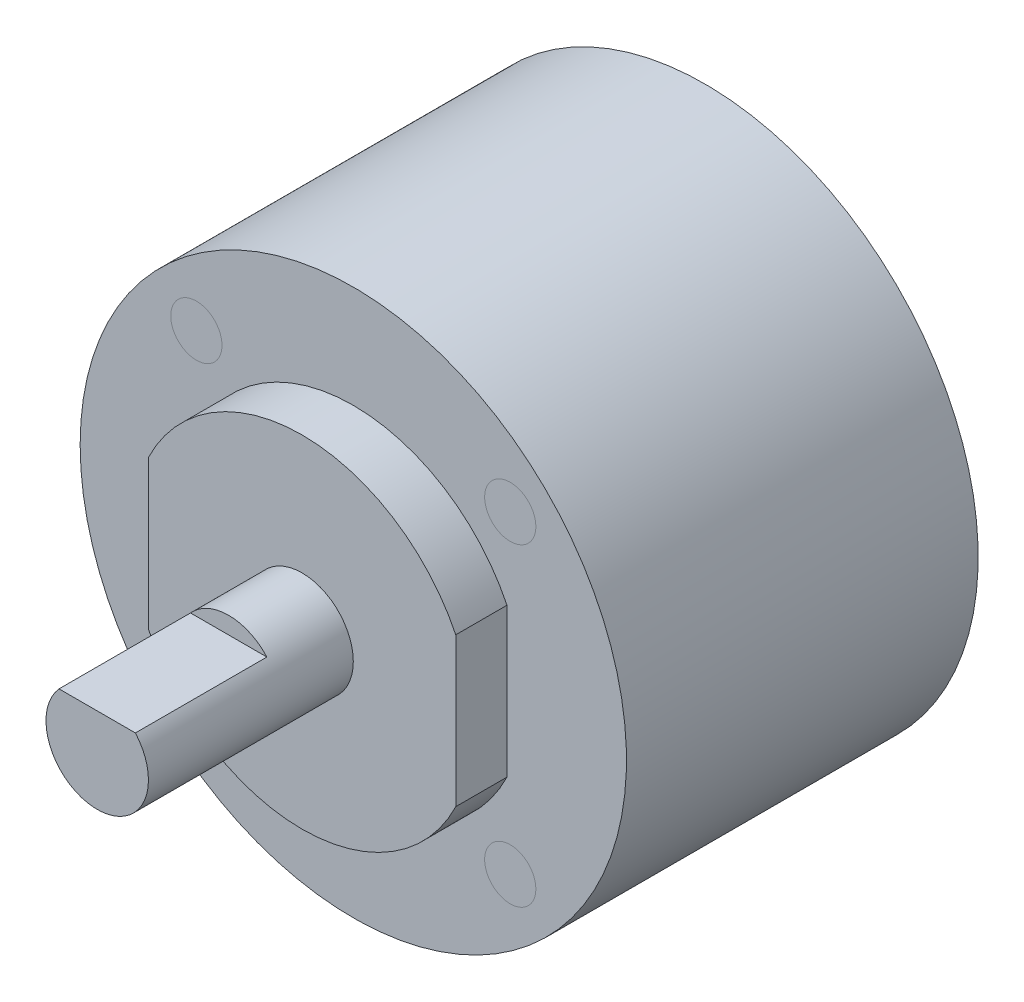
ISO-10303-21;
HEADER;
FILE_DESCRIPTION(('STEP AP214'),'2;1');
FILE_NAME('part.step','',(''),(''),'','','');
FILE_SCHEMA(('AUTOMOTIVE_DESIGN { 1 0 10303 214 1 1 1 1 }'));
ENDSEC;
DATA;
#1=APPLICATION_CONTEXT('core data for automotive mechanical design processes');
#2=APPLICATION_PROTOCOL_DEFINITION('international standard','automotive_design',2000,#1);
#3=PRODUCT_CONTEXT('',#1,'mechanical');
#4=PRODUCT('Part','Part','',(#3));
#5=PRODUCT_RELATED_PRODUCT_CATEGORY('part','',(#4));
#6=PRODUCT_DEFINITION_FORMATION('','',#4);
#7=PRODUCT_DEFINITION_CONTEXT('part definition',#1,'design');
#8=PRODUCT_DEFINITION('design','',#6,#7);
#9=PRODUCT_DEFINITION_SHAPE('','',#8);
#10=(LENGTH_UNIT() NAMED_UNIT(*) SI_UNIT(.MILLI.,.METRE.));
#11=(NAMED_UNIT(*) PLANE_ANGLE_UNIT() SI_UNIT($,.RADIAN.));
#12=(NAMED_UNIT(*) SI_UNIT($,.STERADIAN.) SOLID_ANGLE_UNIT());
#13=UNCERTAINTY_MEASURE_WITH_UNIT(LENGTH_MEASURE(1.E-05),#10,'distance_accuracy_value','');
#14=(GEOMETRIC_REPRESENTATION_CONTEXT(3) GLOBAL_UNCERTAINTY_ASSIGNED_CONTEXT((#13)) GLOBAL_UNIT_ASSIGNED_CONTEXT((#10,
#11,#12)) REPRESENTATION_CONTEXT('',''));
#15=CARTESIAN_POINT('',(0.,0.,0.));
#16=DIRECTION('',(0.,0.,1.));
#17=DIRECTION('',(1.,0.,0.));
#18=AXIS2_PLACEMENT_3D('',#15,#16,#17);
#19=CARTESIAN_POINT('',(0.,0.,39.9));
#20=DIRECTION('',(0.,0.,-1.));
#21=DIRECTION('',(-1.,0.,0.));
#22=AXIS2_PLACEMENT_3D('',#19,#20,#21);
#23=CYLINDRICAL_SURFACE('',#22,3.);
#24=CARTESIAN_POINT('',(0.,0.,23.6));
#25=DIRECTION('',(0.,0.,1.));
#26=DIRECTION('',(1.,0.,0.));
#27=AXIS2_PLACEMENT_3D('',#24,#25,#26);
#28=CIRCLE('',#27,3.);
#29=CARTESIAN_POINT('',(3.,0.,23.6));
#30=VERTEX_POINT('',#29);
#31=EDGE_CURVE('E103',#30,#30,#28,.T.);
#32=ORIENTED_EDGE('',*,*,#31,.T.);
#33=EDGE_LOOP('',(#32));
#34=FACE_BOUND('',#33,.T.);
#35=CARTESIAN_POINT('',(0.,0.,35.6));
#36=DIRECTION('',(0.,0.,1.));
#37=DIRECTION('',(1.,0.,0.));
#38=AXIS2_PLACEMENT_3D('',#35,#36,#37);
#39=CIRCLE('',#38,3.);
#40=CARTESIAN_POINT('',(-2.23606797749979,2.,35.6));
#41=VERTEX_POINT('',#40);
#42=CARTESIAN_POINT('',(2.23606797749979,2.,35.6));
#43=VERTEX_POINT('',#42);
#44=EDGE_CURVE('E48',#41,#43,#39,.T.);
#45=ORIENTED_EDGE('',*,*,#44,.F.);
#46=DIRECTION('',(0.,0.,1.));
#47=VECTOR('',#46,1.);
#48=CARTESIAN_POINT('',(-2.23606797749979,2.,27.9));
#49=LINE('',#48,#47);
#50=CARTESIAN_POINT('',(-2.23606797749979,2.,27.9));
#51=VERTEX_POINT('',#50);
#52=EDGE_CURVE('E91',#51,#41,#49,.T.);
#53=ORIENTED_EDGE('',*,*,#52,.F.);
#54=CARTESIAN_POINT('',(0.,0.,27.9));
#55=DIRECTION('',(0.,0.,1.));
#56=DIRECTION('',(-1.,0.,0.));
#57=AXIS2_PLACEMENT_3D('',#54,#55,#56);
#58=CIRCLE('',#57,3.);
#59=CARTESIAN_POINT('',(2.23606797749979,2.,27.9));
#60=VERTEX_POINT('',#59);
#61=EDGE_CURVE('E93',#60,#51,#58,.T.);
#62=ORIENTED_EDGE('',*,*,#61,.F.);
#63=DIRECTION('',(0.,0.,1.));
#64=VECTOR('',#63,1.);
#65=CARTESIAN_POINT('',(2.23606797749979,2.,27.9));
#66=LINE('',#65,#64);
#67=EDGE_CURVE('E92',#60,#43,#66,.T.);
#68=ORIENTED_EDGE('',*,*,#67,.T.);
#69=EDGE_LOOP('',(#45,#53,#62,#68));
#70=FACE_BOUND('',#69,.T.);
#71=ADVANCED_FACE('F35',(#34,#70),#23,.T.);
#72=CARTESIAN_POINT('',(-2.23606797749979,2.,27.9));
#73=DIRECTION('',(0.,-1.,0.));
#74=DIRECTION('',(0.,0.,-1.));
#75=AXIS2_PLACEMENT_3D('',#72,#73,#74);
#76=PLANE('',#75);
#77=DIRECTION('',(-1.,0.,0.));
#78=VECTOR('',#77,1.);
#79=CARTESIAN_POINT('',(-2.23606797749979,2.,35.6));
#80=LINE('',#79,#78);
#81=EDGE_CURVE('E11',#43,#41,#80,.T.);
#82=ORIENTED_EDGE('',*,*,#81,.F.);
#83=ORIENTED_EDGE('',*,*,#67,.F.);
#84=DIRECTION('',(1.,0.,0.));
#85=VECTOR('',#84,1.);
#86=CARTESIAN_POINT('',(-2.23606797749979,2.,27.9));
#87=LINE('',#86,#85);
#88=EDGE_CURVE('E98',#51,#60,#87,.T.);
#89=ORIENTED_EDGE('',*,*,#88,.F.);
#90=ORIENTED_EDGE('',*,*,#52,.T.);
#91=EDGE_LOOP('',(#82,#83,#89,#90));
#92=FACE_BOUND('',#91,.T.);
#93=ADVANCED_FACE('F96',(#92),#76,.F.);
#94=CARTESIAN_POINT('',(0.,0.,0.));
#95=DIRECTION('',(0.,0.,1.));
#96=DIRECTION('',(1.,0.,0.));
#97=AXIS2_PLACEMENT_3D('',#94,#95,#96);
#98=PLANE('',#97);
#99=CARTESIAN_POINT('',(0.,0.,0.));
#100=DIRECTION('',(0.,0.,1.));
#101=DIRECTION('',(1.,0.,0.));
#102=AXIS2_PLACEMENT_3D('',#99,#100,#101);
#103=CIRCLE('',#102,16.);
#104=CARTESIAN_POINT('',(-16.,0.,0.));
#105=VERTEX_POINT('',#104);
#106=EDGE_CURVE('E138',#105,#105,#103,.T.);
#107=ORIENTED_EDGE('',*,*,#106,.F.);
#108=EDGE_LOOP('',(#107));
#109=FACE_BOUND('',#108,.T.);
#110=CARTESIAN_POINT('',(5.65685424949238,-5.65685424949238,0.));
#111=DIRECTION('',(0.,0.,1.));
#112=DIRECTION('',(1.,0.,0.));
#113=AXIS2_PLACEMENT_3D('',#110,#111,#112);
#114=CIRCLE('',#113,1.55);
#115=CARTESIAN_POINT('',(7.20685424949238,-5.65685424949238,0.));
#116=VERTEX_POINT('',#115);
#117=EDGE_CURVE('E158',#116,#116,#114,.F.);
#118=ORIENTED_EDGE('',*,*,#117,.F.);
#119=EDGE_LOOP('',(#118));
#120=FACE_BOUND('',#119,.T.);
#121=CARTESIAN_POINT('',(-5.65685424949238,5.65685424949238,0.));
#122=DIRECTION('',(0.,0.,1.));
#123=DIRECTION('',(1.,0.,0.));
#124=AXIS2_PLACEMENT_3D('',#121,#122,#123);
#125=CIRCLE('',#124,1.55);
#126=CARTESIAN_POINT('',(-4.10685424949238,5.65685424949238,0.));
#127=VERTEX_POINT('',#126);
#128=EDGE_CURVE('E43',#127,#127,#125,.F.);
#129=ORIENTED_EDGE('',*,*,#128,.F.);
#130=EDGE_LOOP('',(#129));
#131=FACE_BOUND('',#130,.T.);
#132=ADVANCED_FACE('F169',(#109,#120,#131),#98,.F.);
#133=ORIENTED_EDGE('',*,*,#128,.T.);
#134=EDGE_LOOP('',(#133));
#135=FACE_BOUND('',#134,.T.);
#136=ADVANCED_FACE('F167',(#135),#98,.F.);
#137=CARTESIAN_POINT('',(0.,0.,20.6));
#138=DIRECTION('',(0.,0.,1.));
#139=DIRECTION('',(1.,0.,0.));
#140=AXIS2_PLACEMENT_3D('',#137,#138,#139);
#141=PLANE('',#140);
#142=CARTESIAN_POINT('',(-9.1923881554251,-9.19238815542514,20.6));
#143=DIRECTION('',(0.,0.,1.));
#144=DIRECTION('',(1.,0.,0.));
#145=AXIS2_PLACEMENT_3D('',#142,#143,#144);
#146=CIRCLE('',#145,1.5);
#147=CARTESIAN_POINT('',(-7.6923881554251,-9.19238815542514,20.6));
#148=VERTEX_POINT('',#147);
#149=EDGE_CURVE('E150',#148,#148,#146,.F.);
#150=ORIENTED_EDGE('',*,*,#149,.T.);
#151=EDGE_LOOP('',(#150));
#152=FACE_BOUND('',#151,.T.);
#153=CARTESIAN_POINT('',(9.1923881554251,9.19238815542514,20.6));
#154=DIRECTION('',(0.,0.,1.));
#155=DIRECTION('',(1.,0.,0.));
#156=AXIS2_PLACEMENT_3D('',#153,#154,#155);
#157=CIRCLE('',#156,1.5);
#158=CARTESIAN_POINT('',(10.6923881554251,9.19238815542514,20.6));
#159=VERTEX_POINT('',#158);
#160=EDGE_CURVE('E106',#159,#159,#157,.F.);
#161=ORIENTED_EDGE('',*,*,#160,.T.);
#162=EDGE_LOOP('',(#161));
#163=FACE_BOUND('',#162,.T.);
#164=CARTESIAN_POINT('',(0.,0.,20.6));
#165=DIRECTION('',(0.,0.,1.));
#166=DIRECTION('',(1.,0.,0.));
#167=AXIS2_PLACEMENT_3D('',#164,#165,#166);
#168=CIRCLE('',#167,10.);
#169=CARTESIAN_POINT('',(9.,4.35889894354068,20.6));
#170=VERTEX_POINT('',#169);
#171=CARTESIAN_POINT('',(-9.,4.35889894354068,20.6));
#172=VERTEX_POINT('',#171);
#173=EDGE_CURVE('E56',#170,#172,#168,.T.);
#174=ORIENTED_EDGE('',*,*,#173,.F.);
#175=DIRECTION('',(0.,1.,0.));
#176=VECTOR('',#175,1.);
#177=CARTESIAN_POINT('',(9.,-4.35889894354068,20.6));
#178=LINE('',#177,#176);
#179=CARTESIAN_POINT('',(9.,-4.35889894354068,20.6));
#180=VERTEX_POINT('',#179);
#181=EDGE_CURVE('E112',#180,#170,#178,.T.);
#182=ORIENTED_EDGE('',*,*,#181,.F.);
#183=CARTESIAN_POINT('',(0.,0.,20.6));
#184=DIRECTION('',(0.,0.,1.));
#185=DIRECTION('',(1.,0.,0.));
#186=AXIS2_PLACEMENT_3D('',#183,#184,#185);
#187=CIRCLE('',#186,10.);
#188=CARTESIAN_POINT('',(-9.,-4.35889894354068,20.6));
#189=VERTEX_POINT('',#188);
#190=EDGE_CURVE('E123',#189,#180,#187,.T.);
#191=ORIENTED_EDGE('',*,*,#190,.F.);
#192=DIRECTION('',(0.,-1.,0.));
#193=VECTOR('',#192,1.);
#194=CARTESIAN_POINT('',(-9.,4.35889894354068,20.6));
#195=LINE('',#194,#193);
#196=EDGE_CURVE('E120',#172,#189,#195,.T.);
#197=ORIENTED_EDGE('',*,*,#196,.F.);
#198=EDGE_LOOP('',(#174,#182,#191,#197));
#199=FACE_BOUND('',#198,.T.);
#200=CARTESIAN_POINT('',(0.,0.,20.6));
#201=DIRECTION('',(0.,0.,1.));
#202=DIRECTION('',(1.,0.,0.));
#203=AXIS2_PLACEMENT_3D('',#200,#201,#202);
#204=CIRCLE('',#203,16.);
#205=CARTESIAN_POINT('',(-16.,0.,20.6));
#206=VERTEX_POINT('',#205);
#207=EDGE_CURVE('E107',#206,#206,#204,.T.);
#208=ORIENTED_EDGE('',*,*,#207,.T.);
#209=EDGE_LOOP('',(#208));
#210=FACE_BOUND('',#209,.T.);
#211=CARTESIAN_POINT('',(9.19238815542514,-9.1923881554251,20.6));
#212=DIRECTION('',(0.,0.,1.));
#213=DIRECTION('',(1.,0.,0.));
#214=AXIS2_PLACEMENT_3D('',#211,#212,#213);
#215=CIRCLE('',#214,1.5);
#216=CARTESIAN_POINT('',(10.6923881554251,-9.1923881554251,20.6));
#217=VERTEX_POINT('',#216);
#218=EDGE_CURVE('E146',#217,#217,#215,.F.);
#219=ORIENTED_EDGE('',*,*,#218,.T.);
#220=EDGE_LOOP('',(#219));
#221=FACE_BOUND('',#220,.T.);
#222=CARTESIAN_POINT('',(-9.19238815542514,9.1923881554251,20.6));
#223=DIRECTION('',(0.,0.,1.));
#224=DIRECTION('',(1.,0.,0.));
#225=AXIS2_PLACEMENT_3D('',#222,#223,#224);
#226=CIRCLE('',#225,1.5);
#227=CARTESIAN_POINT('',(-7.69238815542514,9.1923881554251,20.6));
#228=VERTEX_POINT('',#227);
#229=EDGE_CURVE('E154',#228,#228,#226,.F.);
#230=ORIENTED_EDGE('',*,*,#229,.T.);
#231=EDGE_LOOP('',(#230));
#232=FACE_BOUND('',#231,.T.);
#233=ADVANCED_FACE('F176',(#152,#163,#199,#210,#221,#232),#141,.T.);
#234=ORIENTED_EDGE('',*,*,#229,.F.);
#235=EDGE_LOOP('',(#234));
#236=FACE_BOUND('',#235,.T.);
#237=ADVANCED_FACE('F222',(#236),#141,.T.);
#238=ORIENTED_EDGE('',*,*,#149,.F.);
#239=EDGE_LOOP('',(#238));
#240=FACE_BOUND('',#239,.T.);
#241=ADVANCED_FACE('F225',(#240),#141,.T.);
#242=ORIENTED_EDGE('',*,*,#218,.F.);
#243=EDGE_LOOP('',(#242));
#244=FACE_BOUND('',#243,.T.);
#245=ADVANCED_FACE('F215',(#244),#141,.T.);
#246=CARTESIAN_POINT('',(0.,0.,20.6));
#247=DIRECTION('',(0.,0.,-1.));
#248=DIRECTION('',(-1.,0.,0.));
#249=AXIS2_PLACEMENT_3D('',#246,#247,#248);
#250=CYLINDRICAL_SURFACE('',#249,16.);
#251=CARTESIAN_POINT('',(-16.,0.,20.6));
#252=CARTESIAN_POINT('',(-16.,0.,20.3854166666667));
#253=CARTESIAN_POINT('',(-16.,0.,20.1708333333333));
#254=CARTESIAN_POINT('',(-16.,0.,19.7416666666667));
#255=CARTESIAN_POINT('',(-16.,0.,19.5270833333333));
#256=CARTESIAN_POINT('',(-16.,0.,19.0979166666667));
#257=CARTESIAN_POINT('',(-16.,0.,18.8833333333333));
#258=CARTESIAN_POINT('',(-16.,0.,18.4541666666667));
#259=CARTESIAN_POINT('',(-16.,0.,18.2395833333333));
#260=CARTESIAN_POINT('',(-16.,0.,17.8104166666667));
#261=CARTESIAN_POINT('',(-16.,0.,17.5958333333333));
#262=CARTESIAN_POINT('',(-16.,0.,17.1666666666667));
#263=CARTESIAN_POINT('',(-16.,0.,16.9520833333333));
#264=CARTESIAN_POINT('',(-16.,0.,16.5229166666667));
#265=CARTESIAN_POINT('',(-16.,0.,16.3083333333333));
#266=CARTESIAN_POINT('',(-16.,0.,15.8791666666667));
#267=CARTESIAN_POINT('',(-16.,0.,15.6645833333333));
#268=CARTESIAN_POINT('',(-16.,0.,15.2354166666667));
#269=CARTESIAN_POINT('',(-16.,0.,15.0208333333333));
#270=CARTESIAN_POINT('',(-16.,0.,14.5916666666667));
#271=CARTESIAN_POINT('',(-16.,0.,14.3770833333333));
#272=CARTESIAN_POINT('',(-16.,0.,13.9479166666667));
#273=CARTESIAN_POINT('',(-16.,0.,13.7333333333333));
#274=CARTESIAN_POINT('',(-16.,0.,13.3041666666667));
#275=CARTESIAN_POINT('',(-16.,0.,13.0895833333333));
#276=CARTESIAN_POINT('',(-16.,0.,12.6604166666667));
#277=CARTESIAN_POINT('',(-16.,0.,12.4458333333333));
#278=CARTESIAN_POINT('',(-16.,0.,12.0166666666667));
#279=CARTESIAN_POINT('',(-16.,0.,11.8020833333333));
#280=CARTESIAN_POINT('',(-16.,0.,11.3729166666667));
#281=CARTESIAN_POINT('',(-16.,0.,11.1583333333333));
#282=CARTESIAN_POINT('',(-16.,0.,10.7291666666667));
#283=CARTESIAN_POINT('',(-16.,0.,10.5145833333333));
#284=CARTESIAN_POINT('',(-16.,0.,10.0854166666667));
#285=CARTESIAN_POINT('',(-16.,0.,9.87083333333333));
#286=CARTESIAN_POINT('',(-16.,0.,9.44166666666666));
#287=CARTESIAN_POINT('',(-16.,0.,9.22708333333333));
#288=CARTESIAN_POINT('',(-16.,0.,8.79791666666666));
#289=CARTESIAN_POINT('',(-16.,0.,8.58333333333333));
#290=CARTESIAN_POINT('',(-16.,0.,8.15416666666666));
#291=CARTESIAN_POINT('',(-16.,0.,7.93958333333333));
#292=CARTESIAN_POINT('',(-16.,0.,7.51041666666666));
#293=CARTESIAN_POINT('',(-16.,0.,7.29583333333333));
#294=CARTESIAN_POINT('',(-16.,0.,6.86666666666666));
#295=CARTESIAN_POINT('',(-16.,0.,6.65208333333333));
#296=CARTESIAN_POINT('',(-16.,0.,6.22291666666666));
#297=CARTESIAN_POINT('',(-16.,0.,6.00833333333333));
#298=CARTESIAN_POINT('',(-16.,0.,5.57916666666666));
#299=CARTESIAN_POINT('',(-16.,0.,5.36458333333333));
#300=CARTESIAN_POINT('',(-16.,0.,4.93541666666666));
#301=CARTESIAN_POINT('',(-16.,0.,4.72083333333333));
#302=CARTESIAN_POINT('',(-16.,0.,4.29166666666667));
#303=CARTESIAN_POINT('',(-16.,0.,4.07708333333333));
#304=CARTESIAN_POINT('',(-16.,0.,3.64791666666666));
#305=CARTESIAN_POINT('',(-16.,0.,3.43333333333333));
#306=CARTESIAN_POINT('',(-16.,0.,3.00416666666666));
#307=CARTESIAN_POINT('',(-16.,0.,2.78958333333333));
#308=CARTESIAN_POINT('',(-16.,0.,2.36041666666666));
#309=CARTESIAN_POINT('',(-16.,0.,2.14583333333333));
#310=CARTESIAN_POINT('',(-16.,0.,1.71666666666667));
#311=CARTESIAN_POINT('',(-16.,0.,1.50208333333333));
#312=CARTESIAN_POINT('',(-16.,0.,1.07291666666666));
#313=CARTESIAN_POINT('',(-16.,0.,0.858333333333329));
#314=CARTESIAN_POINT('',(-16.,0.,0.429166666666662));
#315=CARTESIAN_POINT('',(-16.,0.,0.21458333333333));
#316=CARTESIAN_POINT('',(-16.,0.,0.));
#317=B_SPLINE_CURVE_WITH_KNOTS('',3,(#251,#252,#253,#254,#255,#256,#257,#258,#259,#260,#261,
#262,#263,#264,#265,#266,#267,#268,#269,#270,#271,#272,#273,#274,#275,#276,#277,#278,#279,#280,
#281,#282,#283,#284,#285,#286,#287,#288,#289,#290,#291,#292,#293,#294,#295,#296,#297,#298,#299,
#300,#301,#302,#303,#304,#305,#306,#307,#308,#309,#310,#311,#312,#313,#314,#315,#316),
.UNSPECIFIED.,.F.,.F.,(4,2,2,2,2,2,2,2,2,2,2,2,2,2,2,2,2,2,2,2,2,2,2,2,2,2,2,2,2,2,2,2,4),(0.,
0.643750000000002,1.2875,1.93125,2.575,3.21875,3.8625,4.50625,5.15,5.79375,6.4375,7.08125,7.725,
8.36875,9.0125,9.65625,10.3,10.94375,11.5875,12.23125,12.875,13.51875,14.1625,14.80625,15.45,
16.09375,16.7375,17.38125,18.025,18.66875,19.3125,19.95625,20.6),.UNSPECIFIED.);
#318=EDGE_CURVE('BSEAM37',#206,#105,#317,.T.);
#319=ORIENTED_EDGE('',*,*,#207,.F.);
#320=ORIENTED_EDGE('',*,*,#106,.T.);
#321=ORIENTED_EDGE('',*,*,#318,.T.);
#322=ORIENTED_EDGE('',*,*,#318,.F.);
#323=EDGE_LOOP('',(#319,#321,#320,#322));
#324=FACE_BOUND('',#323,.T.);
#325=ADVANCED_FACE('F37',(#324),#250,.T.);
#326=ORIENTED_EDGE('',*,*,#160,.F.);
#327=EDGE_LOOP('',(#326));
#328=FACE_BOUND('',#327,.T.);
#329=ADVANCED_FACE('F184',(#328),#141,.T.);
#330=ORIENTED_EDGE('',*,*,#117,.T.);
#331=EDGE_LOOP('',(#330));
#332=FACE_BOUND('',#331,.T.);
#333=ADVANCED_FACE('F172',(#332),#98,.F.);
#334=CARTESIAN_POINT('',(0.,0.,23.6));
#335=DIRECTION('',(0.,0.,-1.));
#336=DIRECTION('',(-1.,0.,0.));
#337=AXIS2_PLACEMENT_3D('',#334,#335,#336);
#338=CYLINDRICAL_SURFACE('',#337,10.);
#339=ORIENTED_EDGE('',*,*,#173,.T.);
#340=DIRECTION('',(0.,0.,-1.));
#341=VECTOR('',#340,1.);
#342=CARTESIAN_POINT('',(-9.,4.35889894354068,23.6));
#343=LINE('',#342,#341);
#344=CARTESIAN_POINT('',(-9.,4.35889894354068,23.6));
#345=VERTEX_POINT('',#344);
#346=EDGE_CURVE('E135',#345,#172,#343,.T.);
#347=ORIENTED_EDGE('',*,*,#346,.F.);
#348=CARTESIAN_POINT('',(0.,0.,23.6));
#349=DIRECTION('',(0.,0.,1.));
#350=DIRECTION('',(1.,0.,0.));
#351=AXIS2_PLACEMENT_3D('',#348,#349,#350);
#352=CIRCLE('',#351,10.);
#353=CARTESIAN_POINT('',(9.,4.35889894354068,23.6));
#354=VERTEX_POINT('',#353);
#355=EDGE_CURVE('E108',#354,#345,#352,.T.);
#356=ORIENTED_EDGE('',*,*,#355,.F.);
#357=DIRECTION('',(0.,0.,-1.));
#358=VECTOR('',#357,1.);
#359=CARTESIAN_POINT('',(9.,4.35889894354068,23.6));
#360=LINE('',#359,#358);
#361=EDGE_CURVE('E118',#354,#170,#360,.T.);
#362=ORIENTED_EDGE('',*,*,#361,.T.);
#363=EDGE_LOOP('',(#339,#347,#356,#362));
#364=FACE_BOUND('',#363,.T.);
#365=ADVANCED_FACE('F183',(#364),#338,.T.);
#366=CARTESIAN_POINT('',(-9.,4.35889894354068,23.6));
#367=DIRECTION('',(1.,0.,0.));
#368=DIRECTION('',(0.,0.,-1.));
#369=AXIS2_PLACEMENT_3D('',#366,#367,#368);
#370=PLANE('',#369);
#371=ORIENTED_EDGE('',*,*,#196,.T.);
#372=DIRECTION('',(0.,0.,-1.));
#373=VECTOR('',#372,1.);
#374=CARTESIAN_POINT('',(-9.,-4.35889894354068,23.6));
#375=LINE('',#374,#373);
#376=CARTESIAN_POINT('',(-9.,-4.35889894354068,23.6));
#377=VERTEX_POINT('',#376);
#378=EDGE_CURVE('E132',#377,#189,#375,.T.);
#379=ORIENTED_EDGE('',*,*,#378,.F.);
#380=DIRECTION('',(0.,-1.,0.));
#381=VECTOR('',#380,1.);
#382=CARTESIAN_POINT('',(-9.,4.35889894354068,23.6));
#383=LINE('',#382,#381);
#384=EDGE_CURVE('E111',#345,#377,#383,.T.);
#385=ORIENTED_EDGE('',*,*,#384,.F.);
#386=ORIENTED_EDGE('',*,*,#346,.T.);
#387=EDGE_LOOP('',(#371,#379,#385,#386));
#388=FACE_BOUND('',#387,.T.);
#389=ADVANCED_FACE('F206',(#388),#370,.F.);
#390=CARTESIAN_POINT('',(0.,0.,23.6));
#391=DIRECTION('',(0.,0.,-1.));
#392=DIRECTION('',(-1.,0.,0.));
#393=AXIS2_PLACEMENT_3D('',#390,#391,#392);
#394=CYLINDRICAL_SURFACE('',#393,10.);
#395=ORIENTED_EDGE('',*,*,#190,.T.);
#396=DIRECTION('',(0.,0.,-1.));
#397=VECTOR('',#396,1.);
#398=CARTESIAN_POINT('',(9.,-4.35889894354068,23.6));
#399=LINE('',#398,#397);
#400=CARTESIAN_POINT('',(9.,-4.35889894354068,23.6));
#401=VERTEX_POINT('',#400);
#402=EDGE_CURVE('E129',#401,#180,#399,.T.);
#403=ORIENTED_EDGE('',*,*,#402,.F.);
#404=CARTESIAN_POINT('',(0.,0.,23.6));
#405=DIRECTION('',(0.,0.,1.));
#406=DIRECTION('',(1.,0.,0.));
#407=AXIS2_PLACEMENT_3D('',#404,#405,#406);
#408=CIRCLE('',#407,10.);
#409=EDGE_CURVE('E114',#377,#401,#408,.T.);
#410=ORIENTED_EDGE('',*,*,#409,.F.);
#411=ORIENTED_EDGE('',*,*,#378,.T.);
#412=EDGE_LOOP('',(#395,#403,#410,#411));
#413=FACE_BOUND('',#412,.T.);
#414=ADVANCED_FACE('F202',(#413),#394,.T.);
#415=CARTESIAN_POINT('',(9.,-4.35889894354068,23.6));
#416=DIRECTION('',(-1.,0.,0.));
#417=DIRECTION('',(0.,0.,1.));
#418=AXIS2_PLACEMENT_3D('',#415,#416,#417);
#419=PLANE('',#418);
#420=ORIENTED_EDGE('',*,*,#181,.T.);
#421=ORIENTED_EDGE('',*,*,#361,.F.);
#422=DIRECTION('',(0.,1.,0.));
#423=VECTOR('',#422,1.);
#424=CARTESIAN_POINT('',(9.,-4.35889894354068,23.6));
#425=LINE('',#424,#423);
#426=EDGE_CURVE('E116',#401,#354,#425,.T.);
#427=ORIENTED_EDGE('',*,*,#426,.F.);
#428=ORIENTED_EDGE('',*,*,#402,.T.);
#429=EDGE_LOOP('',(#420,#421,#427,#428));
#430=FACE_BOUND('',#429,.T.);
#431=ADVANCED_FACE('F198',(#430),#419,.F.);
#432=CARTESIAN_POINT('',(0.,0.,23.6));
#433=DIRECTION('',(0.,0.,1.));
#434=DIRECTION('',(1.,0.,0.));
#435=AXIS2_PLACEMENT_3D('',#432,#433,#434);
#436=PLANE('',#435);
#437=ORIENTED_EDGE('',*,*,#31,.F.);
#438=EDGE_LOOP('',(#437));
#439=FACE_BOUND('',#438,.T.);
#440=ORIENTED_EDGE('',*,*,#355,.T.);
#441=ORIENTED_EDGE('',*,*,#384,.T.);
#442=ORIENTED_EDGE('',*,*,#409,.T.);
#443=ORIENTED_EDGE('',*,*,#426,.T.);
#444=EDGE_LOOP('',(#440,#441,#442,#443));
#445=FACE_BOUND('',#444,.T.);
#446=ADVANCED_FACE('F194',(#439,#445),#436,.T.);
#447=CARTESIAN_POINT('',(0.,0.,27.9));
#448=DIRECTION('',(0.,0.,-1.));
#449=DIRECTION('',(-1.,0.,0.));
#450=AXIS2_PLACEMENT_3D('',#447,#448,#449);
#451=PLANE('',#450);
#452=ORIENTED_EDGE('',*,*,#61,.T.);
#453=ORIENTED_EDGE('',*,*,#88,.T.);
#454=EDGE_LOOP('',(#452,#453));
#455=FACE_BOUND('',#454,.T.);
#456=ADVANCED_FACE('F197',(#455),#451,.F.);
#457=CARTESIAN_POINT('',(0.,0.,35.6));
#458=DIRECTION('',(0.,0.,1.));
#459=DIRECTION('',(1.,0.,0.));
#460=AXIS2_PLACEMENT_3D('',#457,#458,#459);
#461=PLANE('',#460);
#462=ORIENTED_EDGE('',*,*,#81,.T.);
#463=ORIENTED_EDGE('',*,*,#44,.T.);
#464=EDGE_LOOP('',(#462,#463));
#465=FACE_BOUND('',#464,.T.);
#466=ADVANCED_FACE('F84',(#465),#461,.T.);
#467=CLOSED_SHELL('',(#71,#93,#132,#136,#233,#237,#241,#245,#325,#329,#333,#365,#389,#414,#431,
#446,#456,#466));
#468=MANIFOLD_SOLID_BREP('B2',#467);
#469=ADVANCED_BREP_SHAPE_REPRESENTATION('',(#18,#468),#14);
#470=SHAPE_DEFINITION_REPRESENTATION(#9,#469);
ENDSEC;
END-ISO-10303-21;
